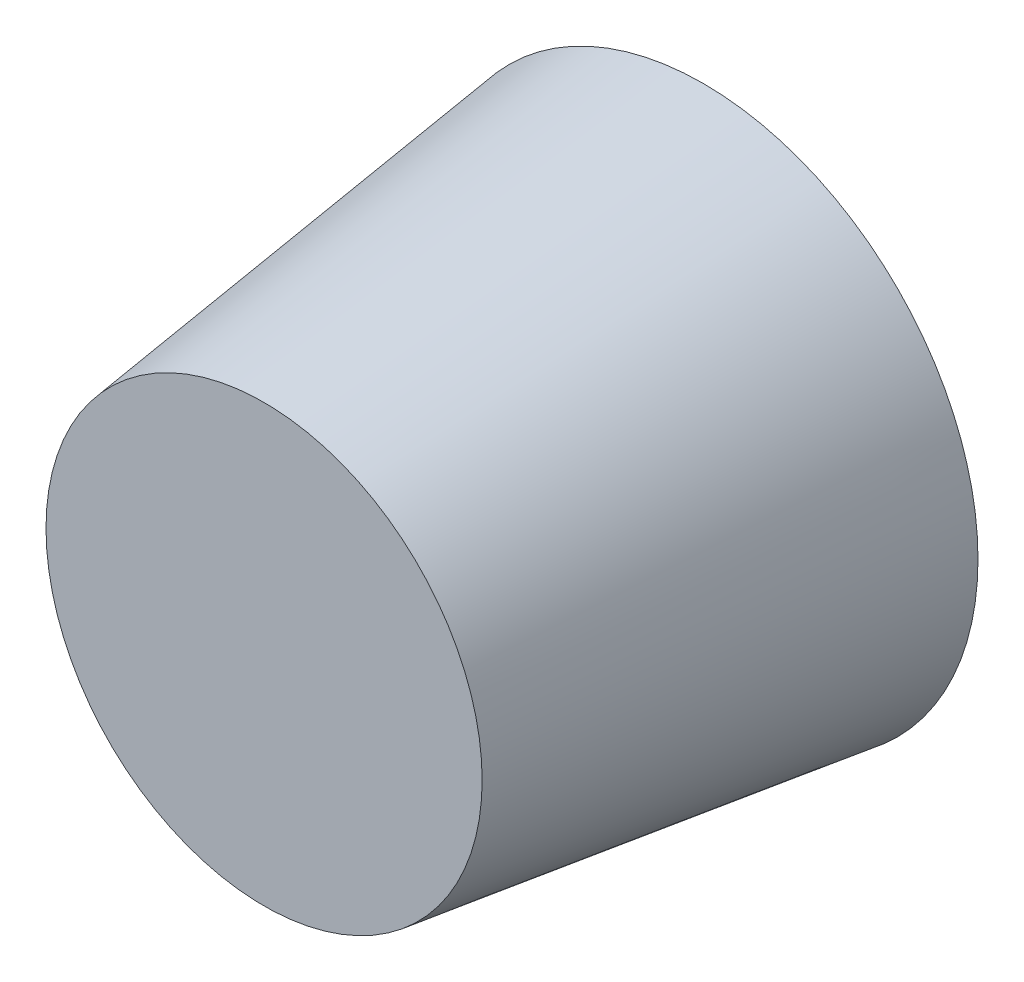
ISO-10303-21;
HEADER;
FILE_DESCRIPTION(('STEP AP214'),'2;1');
FILE_NAME('part.step','',(''),(''),'','','');
FILE_SCHEMA(('AUTOMOTIVE_DESIGN { 1 0 10303 214 1 1 1 1 }'));
ENDSEC;
DATA;
#1=APPLICATION_CONTEXT('core data for automotive mechanical design processes');
#2=APPLICATION_PROTOCOL_DEFINITION('international standard','automotive_design',2000,#1);
#3=PRODUCT_CONTEXT('',#1,'mechanical');
#4=PRODUCT('Part','Part','',(#3));
#5=PRODUCT_RELATED_PRODUCT_CATEGORY('part','',(#4));
#6=PRODUCT_DEFINITION_FORMATION('','',#4);
#7=PRODUCT_DEFINITION_CONTEXT('part definition',#1,'design');
#8=PRODUCT_DEFINITION('design','',#6,#7);
#9=PRODUCT_DEFINITION_SHAPE('','',#8);
#10=(LENGTH_UNIT() NAMED_UNIT(*) SI_UNIT(.MILLI.,.METRE.));
#11=(NAMED_UNIT(*) PLANE_ANGLE_UNIT() SI_UNIT($,.RADIAN.));
#12=(NAMED_UNIT(*) SI_UNIT($,.STERADIAN.) SOLID_ANGLE_UNIT());
#13=UNCERTAINTY_MEASURE_WITH_UNIT(LENGTH_MEASURE(1.E-05),#10,'distance_accuracy_value','');
#14=(GEOMETRIC_REPRESENTATION_CONTEXT(3) GLOBAL_UNCERTAINTY_ASSIGNED_CONTEXT((#13)) GLOBAL_UNIT_ASSIGNED_CONTEXT((#10,
#11,#12)) REPRESENTATION_CONTEXT('',''));
#15=CARTESIAN_POINT('',(0.,0.,0.));
#16=DIRECTION('',(0.,0.,1.));
#17=DIRECTION('',(1.,0.,0.));
#18=AXIS2_PLACEMENT_3D('',#15,#16,#17);
#19=CARTESIAN_POINT('',(0.,0.,0.));
#20=DIRECTION('',(0.,0.,1.));
#21=DIRECTION('',(1.,0.,0.));
#22=AXIS2_PLACEMENT_3D('',#19,#20,#21);
#23=PLANE('',#22);
#24=CARTESIAN_POINT('',(0.,0.,0.));
#25=DIRECTION('',(0.,0.,-1.));
#26=DIRECTION('',(-1.,0.,0.));
#27=AXIS2_PLACEMENT_3D('',#24,#25,#26);
#28=CIRCLE('',#27,2.55);
#29=CARTESIAN_POINT('',(-2.55,0.,0.));
#30=VERTEX_POINT('',#29);
#31=EDGE_CURVE('E47',#30,#30,#28,.T.);
#32=ORIENTED_EDGE('',*,*,#31,.F.);
#33=EDGE_LOOP('',(#32));
#34=FACE_BOUND('',#33,.T.);
#35=CARTESIAN_POINT('',(0.,0.,0.));
#36=DIRECTION('',(0.,0.,1.));
#37=DIRECTION('',(1.,0.,0.));
#38=AXIS2_PLACEMENT_3D('',#35,#36,#37);
#39=CIRCLE('',#38,5.);
#40=CARTESIAN_POINT('',(5.,0.,0.));
#41=VERTEX_POINT('',#40);
#42=EDGE_CURVE('E10',#41,#41,#39,.T.);
#43=ORIENTED_EDGE('',*,*,#42,.F.);
#44=EDGE_LOOP('',(#43));
#45=FACE_BOUND('',#44,.T.);
#46=ADVANCED_FACE('F33',(#34,#45),#23,.F.);
#47=CARTESIAN_POINT('',(0.,0.,8.));
#48=DIRECTION('',(0.,0.,-1.));
#49=DIRECTION('',(-1.,0.,0.));
#50=AXIS2_PLACEMENT_3D('',#47,#48,#49);
#51=CONICAL_SURFACE('',#50,3.97096304852017,0.127927162222424);
#52=ORIENTED_EDGE('',*,*,#42,.T.);
#53=EDGE_LOOP('',(#52));
#54=FACE_BOUND('',#53,.T.);
#55=CARTESIAN_POINT('',(0.,0.,8.));
#56=DIRECTION('',(0.,0.,1.));
#57=DIRECTION('',(1.,0.,0.));
#58=AXIS2_PLACEMENT_3D('',#55,#56,#57);
#59=CIRCLE('',#58,3.97096304852017);
#60=CARTESIAN_POINT('',(3.97096304852017,0.,8.));
#61=VERTEX_POINT('',#60);
#62=EDGE_CURVE('E39',#61,#61,#59,.T.);
#63=ORIENTED_EDGE('',*,*,#62,.F.);
#64=EDGE_LOOP('',(#63));
#65=FACE_BOUND('',#64,.T.);
#66=ADVANCED_FACE('F57',(#54,#65),#51,.T.);
#67=CARTESIAN_POINT('',(0.,0.,8.));
#68=DIRECTION('',(0.,0.,1.));
#69=DIRECTION('',(1.,0.,0.));
#70=AXIS2_PLACEMENT_3D('',#67,#68,#69);
#71=PLANE('',#70);
#72=ORIENTED_EDGE('',*,*,#62,.T.);
#73=EDGE_LOOP('',(#72));
#74=FACE_BOUND('',#73,.T.);
#75=ADVANCED_FACE('F61',(#74),#71,.T.);
#76=CARTESIAN_POINT('',(0.,0.,4.));
#77=DIRECTION('',(0.,0.,-1.));
#78=DIRECTION('',(-1.,0.,0.));
#79=AXIS2_PLACEMENT_3D('',#76,#77,#78);
#80=CYLINDRICAL_SURFACE('',#79,2.55);
#81=CARTESIAN_POINT('',(0.,0.,4.));
#82=DIRECTION('',(0.,0.,-1.));
#83=DIRECTION('',(-1.,0.,0.));
#84=AXIS2_PLACEMENT_3D('',#81,#82,#83);
#85=CIRCLE('',#84,2.55);
#86=CARTESIAN_POINT('',(-2.55,0.,4.));
#87=VERTEX_POINT('',#86);
#88=EDGE_CURVE('E43',#87,#87,#85,.T.);
#89=ORIENTED_EDGE('',*,*,#88,.F.);
#90=EDGE_LOOP('',(#89));
#91=FACE_BOUND('',#90,.T.);
#92=ORIENTED_EDGE('',*,*,#31,.T.);
#93=EDGE_LOOP('',(#92));
#94=FACE_BOUND('',#93,.T.);
#95=ADVANCED_FACE('F53',(#91,#94),#80,.F.);
#96=CARTESIAN_POINT('',(0.,0.,4.));
#97=DIRECTION('',(0.,0.,-1.));
#98=DIRECTION('',(-1.,0.,0.));
#99=AXIS2_PLACEMENT_3D('',#96,#97,#98);
#100=PLANE('',#99);
#101=ORIENTED_EDGE('',*,*,#88,.T.);
#102=EDGE_LOOP('',(#101));
#103=FACE_BOUND('',#102,.T.);
#104=ADVANCED_FACE('F70',(#103),#100,.T.);
#105=CLOSED_SHELL('',(#46,#66,#75,#95,#104));
#106=MANIFOLD_SOLID_BREP('B2',#105);
#107=ADVANCED_BREP_SHAPE_REPRESENTATION('',(#18,#106),#14);
#108=SHAPE_DEFINITION_REPRESENTATION(#9,#107);
ENDSEC;
END-ISO-10303-21;
